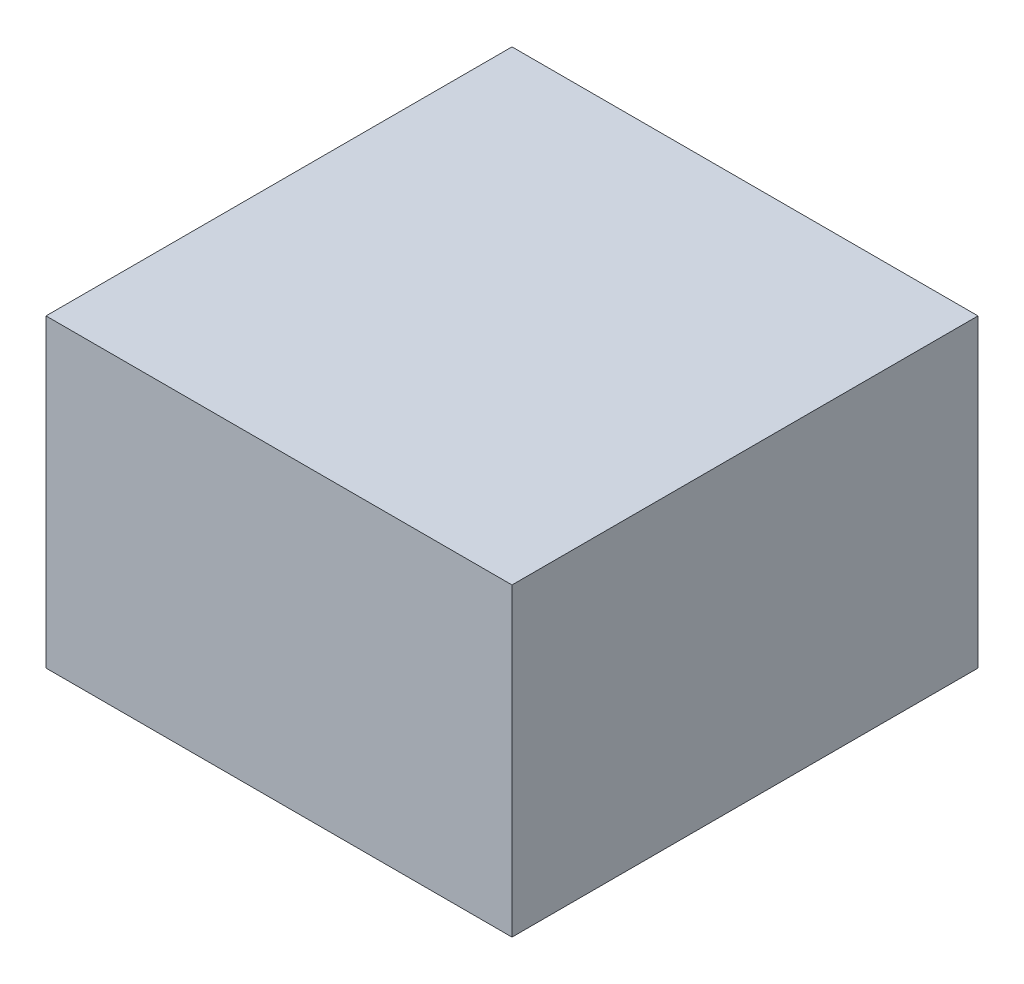
ISO-10303-21;
HEADER;
FILE_DESCRIPTION(('STEP AP214'),'2;1');
FILE_NAME('part.step','',(''),(''),'','','');
FILE_SCHEMA(('AUTOMOTIVE_DESIGN { 1 0 10303 214 1 1 1 1 }'));
ENDSEC;
DATA;
#1=APPLICATION_CONTEXT('core data for automotive mechanical design processes');
#2=APPLICATION_PROTOCOL_DEFINITION('international standard','automotive_design',2000,#1);
#3=PRODUCT_CONTEXT('',#1,'mechanical');
#4=PRODUCT('Part','Part','',(#3));
#5=PRODUCT_RELATED_PRODUCT_CATEGORY('part','',(#4));
#6=PRODUCT_DEFINITION_FORMATION('','',#4);
#7=PRODUCT_DEFINITION_CONTEXT('part definition',#1,'design');
#8=PRODUCT_DEFINITION('design','',#6,#7);
#9=PRODUCT_DEFINITION_SHAPE('','',#8);
#10=(LENGTH_UNIT() NAMED_UNIT(*) SI_UNIT(.MILLI.,.METRE.));
#11=(NAMED_UNIT(*) PLANE_ANGLE_UNIT() SI_UNIT($,.RADIAN.));
#12=(NAMED_UNIT(*) SI_UNIT($,.STERADIAN.) SOLID_ANGLE_UNIT());
#13=UNCERTAINTY_MEASURE_WITH_UNIT(LENGTH_MEASURE(1.E-05),#10,'distance_accuracy_value','');
#14=(GEOMETRIC_REPRESENTATION_CONTEXT(3) GLOBAL_UNCERTAINTY_ASSIGNED_CONTEXT((#13)) GLOBAL_UNIT_ASSIGNED_CONTEXT((#10,
#11,#12)) REPRESENTATION_CONTEXT('',''));
#15=CARTESIAN_POINT('',(0.,0.,0.));
#16=DIRECTION('',(0.,0.,1.));
#17=DIRECTION('',(1.,0.,0.));
#18=AXIS2_PLACEMENT_3D('',#15,#16,#17);
#19=CARTESIAN_POINT('',(275.,360.,275.));
#20=DIRECTION('',(-1.,0.,0.));
#21=DIRECTION('',(0.,0.,1.));
#22=AXIS2_PLACEMENT_3D('',#19,#20,#21);
#23=PLANE('',#22);
#24=DIRECTION('',(0.,0.,-1.));
#25=VECTOR('',#24,1.);
#26=CARTESIAN_POINT('',(275.,0.,275.));
#27=LINE('',#26,#25);
#28=CARTESIAN_POINT('',(275.,0.,275.));
#29=VERTEX_POINT('',#28);
#30=CARTESIAN_POINT('',(275.,0.,-275.));
#31=VERTEX_POINT('',#30);
#32=EDGE_CURVE('E106',#29,#31,#27,.T.);
#33=ORIENTED_EDGE('',*,*,#32,.T.);
#34=DIRECTION('',(0.,-1.,0.));
#35=VECTOR('',#34,1.);
#36=CARTESIAN_POINT('',(275.,360.,-275.));
#37=LINE('',#36,#35);
#38=CARTESIAN_POINT('',(275.,360.,-275.));
#39=VERTEX_POINT('',#38);
#40=EDGE_CURVE('E11',#39,#31,#37,.T.);
#41=ORIENTED_EDGE('',*,*,#40,.F.);
#42=DIRECTION('',(0.,0.,-1.));
#43=VECTOR('',#42,1.);
#44=CARTESIAN_POINT('',(275.,360.,275.));
#45=LINE('',#44,#43);
#46=CARTESIAN_POINT('',(275.,360.,275.));
#47=VERTEX_POINT('',#46);
#48=EDGE_CURVE('E90',#47,#39,#45,.T.);
#49=ORIENTED_EDGE('',*,*,#48,.F.);
#50=DIRECTION('',(0.,-1.,0.));
#51=VECTOR('',#50,1.);
#52=CARTESIAN_POINT('',(275.,360.,275.));
#53=LINE('',#52,#51);
#54=EDGE_CURVE('E102',#47,#29,#53,.T.);
#55=ORIENTED_EDGE('',*,*,#54,.T.);
#56=EDGE_LOOP('',(#33,#41,#49,#55));
#57=FACE_BOUND('',#56,.T.);
#58=ADVANCED_FACE('F38',(#57),#23,.F.);
#59=CARTESIAN_POINT('',(-275.,360.,-275.));
#60=DIRECTION('',(0.,0.,1.));
#61=DIRECTION('',(1.,0.,0.));
#62=AXIS2_PLACEMENT_3D('',#59,#60,#61);
#63=PLANE('',#62);
#64=DIRECTION('',(-1.,0.,0.));
#65=VECTOR('',#64,1.);
#66=CARTESIAN_POINT('',(-275.,0.,-275.));
#67=LINE('',#66,#65);
#68=CARTESIAN_POINT('',(-275.,0.,-275.));
#69=VERTEX_POINT('',#68);
#70=EDGE_CURVE('E95',#31,#69,#67,.T.);
#71=ORIENTED_EDGE('',*,*,#70,.T.);
#72=DIRECTION('',(0.,-1.,0.));
#73=VECTOR('',#72,1.);
#74=CARTESIAN_POINT('',(-275.,360.,-275.));
#75=LINE('',#74,#73);
#76=CARTESIAN_POINT('',(-275.,360.,-275.));
#77=VERTEX_POINT('',#76);
#78=EDGE_CURVE('E47',#77,#69,#75,.T.);
#79=ORIENTED_EDGE('',*,*,#78,.F.);
#80=DIRECTION('',(-1.,0.,0.));
#81=VECTOR('',#80,1.);
#82=CARTESIAN_POINT('',(-275.,360.,-275.));
#83=LINE('',#82,#81);
#84=EDGE_CURVE('E85',#39,#77,#83,.T.);
#85=ORIENTED_EDGE('',*,*,#84,.F.);
#86=ORIENTED_EDGE('',*,*,#40,.T.);
#87=EDGE_LOOP('',(#71,#79,#85,#86));
#88=FACE_BOUND('',#87,.T.);
#89=ADVANCED_FACE('F94',(#88),#63,.F.);
#90=CARTESIAN_POINT('',(-275.,360.,275.));
#91=DIRECTION('',(1.,0.,0.));
#92=DIRECTION('',(0.,0.,-1.));
#93=AXIS2_PLACEMENT_3D('',#90,#91,#92);
#94=PLANE('',#93);
#95=DIRECTION('',(0.,0.,1.));
#96=VECTOR('',#95,1.);
#97=CARTESIAN_POINT('',(-275.,0.,275.));
#98=LINE('',#97,#96);
#99=CARTESIAN_POINT('',(-275.,0.,275.));
#100=VERTEX_POINT('',#99);
#101=EDGE_CURVE('E72',#69,#100,#98,.T.);
#102=ORIENTED_EDGE('',*,*,#101,.T.);
#103=DIRECTION('',(0.,-1.,0.));
#104=VECTOR('',#103,1.);
#105=CARTESIAN_POINT('',(-275.,360.,275.));
#106=LINE('',#105,#104);
#107=CARTESIAN_POINT('',(-275.,360.,275.));
#108=VERTEX_POINT('',#107);
#109=EDGE_CURVE('E97',#108,#100,#106,.T.);
#110=ORIENTED_EDGE('',*,*,#109,.F.);
#111=DIRECTION('',(0.,0.,1.));
#112=VECTOR('',#111,1.);
#113=CARTESIAN_POINT('',(-275.,360.,275.));
#114=LINE('',#113,#112);
#115=EDGE_CURVE('E88',#77,#108,#114,.T.);
#116=ORIENTED_EDGE('',*,*,#115,.F.);
#117=ORIENTED_EDGE('',*,*,#78,.T.);
#118=EDGE_LOOP('',(#102,#110,#116,#117));
#119=FACE_BOUND('',#118,.T.);
#120=ADVANCED_FACE('F98',(#119),#94,.F.);
#121=CARTESIAN_POINT('',(-275.,360.,275.));
#122=DIRECTION('',(0.,0.,-1.));
#123=DIRECTION('',(-1.,0.,0.));
#124=AXIS2_PLACEMENT_3D('',#121,#122,#123);
#125=PLANE('',#124);
#126=DIRECTION('',(1.,0.,0.));
#127=VECTOR('',#126,1.);
#128=CARTESIAN_POINT('',(-275.,0.,275.));
#129=LINE('',#128,#127);
#130=EDGE_CURVE('E78',#100,#29,#129,.T.);
#131=ORIENTED_EDGE('',*,*,#130,.T.);
#132=ORIENTED_EDGE('',*,*,#54,.F.);
#133=DIRECTION('',(1.,0.,0.));
#134=VECTOR('',#133,1.);
#135=CARTESIAN_POINT('',(-275.,360.,275.));
#136=LINE('',#135,#134);
#137=EDGE_CURVE('E55',#108,#47,#136,.T.);
#138=ORIENTED_EDGE('',*,*,#137,.F.);
#139=ORIENTED_EDGE('',*,*,#109,.T.);
#140=EDGE_LOOP('',(#131,#132,#138,#139));
#141=FACE_BOUND('',#140,.T.);
#142=ADVANCED_FACE('F119',(#141),#125,.F.);
#143=CARTESIAN_POINT('',(0.,360.,0.));
#144=DIRECTION('',(0.,-1.,0.));
#145=DIRECTION('',(0.,0.,-1.));
#146=AXIS2_PLACEMENT_3D('',#143,#144,#145);
#147=PLANE('',#146);
#148=ORIENTED_EDGE('',*,*,#48,.T.);
#149=ORIENTED_EDGE('',*,*,#84,.T.);
#150=ORIENTED_EDGE('',*,*,#115,.T.);
#151=ORIENTED_EDGE('',*,*,#137,.T.);
#152=EDGE_LOOP('',(#148,#149,#150,#151));
#153=FACE_BOUND('',#152,.T.);
#154=ADVANCED_FACE('F86',(#153),#147,.F.);
#155=CARTESIAN_POINT('',(0.,0.,0.));
#156=DIRECTION('',(0.,-1.,0.));
#157=DIRECTION('',(0.,0.,-1.));
#158=AXIS2_PLACEMENT_3D('',#155,#156,#157);
#159=PLANE('',#158);
#160=ORIENTED_EDGE('',*,*,#32,.F.);
#161=ORIENTED_EDGE('',*,*,#130,.F.);
#162=ORIENTED_EDGE('',*,*,#101,.F.);
#163=ORIENTED_EDGE('',*,*,#70,.F.);
#164=EDGE_LOOP('',(#160,#161,#162,#163));
#165=FACE_BOUND('',#164,.T.);
#166=ADVANCED_FACE('F122',(#165),#159,.T.);
#167=CLOSED_SHELL('',(#58,#89,#120,#142,#154,#166));
#168=MANIFOLD_SOLID_BREP('B2',#167);
#169=ADVANCED_BREP_SHAPE_REPRESENTATION('',(#18,#168),#14);
#170=SHAPE_DEFINITION_REPRESENTATION(#9,#169);
ENDSEC;
END-ISO-10303-21;
